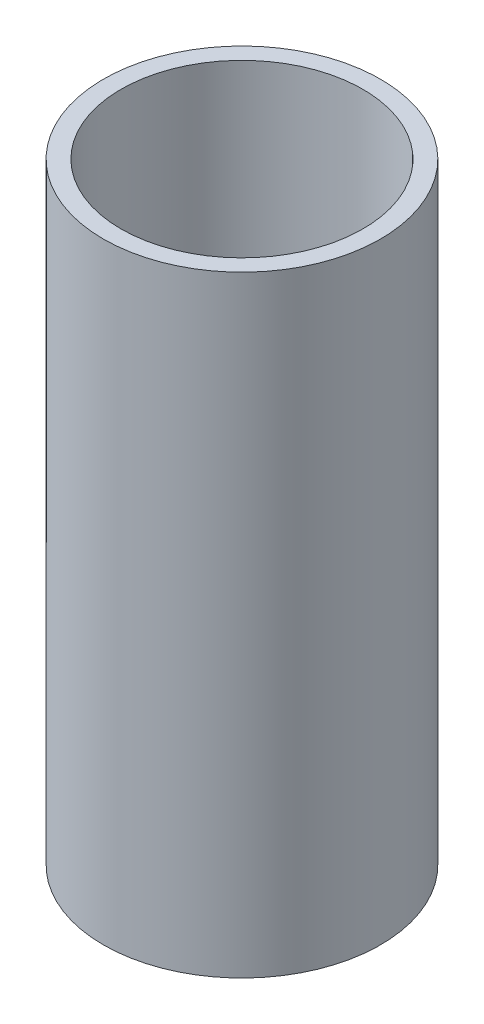
ISO-10303-21;
HEADER;
FILE_DESCRIPTION(('STEP AP214'),'2;1');
FILE_NAME('part.step','',(''),(''),'','','');
FILE_SCHEMA(('AUTOMOTIVE_DESIGN { 1 0 10303 214 1 1 1 1 }'));
ENDSEC;
DATA;
#1=APPLICATION_CONTEXT('core data for automotive mechanical design processes');
#2=APPLICATION_PROTOCOL_DEFINITION('international standard','automotive_design',2000,#1);
#3=PRODUCT_CONTEXT('',#1,'mechanical');
#4=PRODUCT('Part','Part','',(#3));
#5=PRODUCT_RELATED_PRODUCT_CATEGORY('part','',(#4));
#6=PRODUCT_DEFINITION_FORMATION('','',#4);
#7=PRODUCT_DEFINITION_CONTEXT('part definition',#1,'design');
#8=PRODUCT_DEFINITION('design','',#6,#7);
#9=PRODUCT_DEFINITION_SHAPE('','',#8);
#10=(LENGTH_UNIT() NAMED_UNIT(*) SI_UNIT(.MILLI.,.METRE.));
#11=(NAMED_UNIT(*) PLANE_ANGLE_UNIT() SI_UNIT($,.RADIAN.));
#12=(NAMED_UNIT(*) SI_UNIT($,.STERADIAN.) SOLID_ANGLE_UNIT());
#13=UNCERTAINTY_MEASURE_WITH_UNIT(LENGTH_MEASURE(1.E-05),#10,'distance_accuracy_value','');
#14=(GEOMETRIC_REPRESENTATION_CONTEXT(3) GLOBAL_UNCERTAINTY_ASSIGNED_CONTEXT((#13)) GLOBAL_UNIT_ASSIGNED_CONTEXT((#10,
#11,#12)) REPRESENTATION_CONTEXT('',''));
#15=CARTESIAN_POINT('',(0.,0.,0.));
#16=DIRECTION('',(0.,0.,1.));
#17=DIRECTION('',(1.,0.,0.));
#18=AXIS2_PLACEMENT_3D('',#15,#16,#17);
#19=CARTESIAN_POINT('',(0.,31.,0.));
#20=DIRECTION('',(0.,1.,0.));
#21=DIRECTION('',(0.,0.,1.));
#22=AXIS2_PLACEMENT_3D('',#19,#20,#21);
#23=PLANE('',#22);
#24=CARTESIAN_POINT('',(0.,31.,0.));
#25=DIRECTION('',(0.,1.,0.));
#26=DIRECTION('',(0.,0.,1.));
#27=AXIS2_PLACEMENT_3D('',#24,#25,#26);
#28=CIRCLE('',#27,7.025);
#29=CARTESIAN_POINT('',(0.,31.,7.025));
#30=VERTEX_POINT('',#29);
#31=EDGE_CURVE('E10',#30,#30,#28,.T.);
#32=ORIENTED_EDGE('',*,*,#31,.T.);
#33=EDGE_LOOP('',(#32));
#34=FACE_BOUND('',#33,.T.);
#35=CARTESIAN_POINT('',(0.,31.,0.));
#36=DIRECTION('',(0.,1.,0.));
#37=DIRECTION('',(0.,0.,1.));
#38=AXIS2_PLACEMENT_3D('',#35,#36,#37);
#39=CIRCLE('',#38,6.135);
#40=CARTESIAN_POINT('',(0.,31.,6.135));
#41=VERTEX_POINT('',#40);
#42=EDGE_CURVE('E56',#41,#41,#39,.T.);
#43=ORIENTED_EDGE('',*,*,#42,.F.);
#44=EDGE_LOOP('',(#43));
#45=FACE_BOUND('',#44,.T.);
#46=ADVANCED_FACE('F43',(#34,#45),#23,.T.);
#47=CARTESIAN_POINT('',(0.,0.,0.));
#48=DIRECTION('',(0.,1.,0.));
#49=DIRECTION('',(0.,0.,1.));
#50=AXIS2_PLACEMENT_3D('',#47,#48,#49);
#51=PLANE('',#50);
#52=CARTESIAN_POINT('',(0.,0.,0.));
#53=DIRECTION('',(0.,1.,0.));
#54=DIRECTION('',(0.,0.,1.));
#55=AXIS2_PLACEMENT_3D('',#52,#53,#54);
#56=CIRCLE('',#55,7.025);
#57=CARTESIAN_POINT('',(0.,0.,7.025));
#58=VERTEX_POINT('',#57);
#59=EDGE_CURVE('E47',#58,#58,#56,.T.);
#60=ORIENTED_EDGE('',*,*,#59,.F.);
#61=EDGE_LOOP('',(#60));
#62=FACE_BOUND('',#61,.T.);
#63=CARTESIAN_POINT('',(0.,0.,0.));
#64=DIRECTION('',(0.,1.,0.));
#65=DIRECTION('',(0.,0.,1.));
#66=AXIS2_PLACEMENT_3D('',#63,#64,#65);
#67=CIRCLE('',#66,6.135);
#68=CARTESIAN_POINT('',(0.,0.,6.135));
#69=VERTEX_POINT('',#68);
#70=EDGE_CURVE('E58',#69,#69,#67,.T.);
#71=ORIENTED_EDGE('',*,*,#70,.T.);
#72=EDGE_LOOP('',(#71));
#73=FACE_BOUND('',#72,.T.);
#74=ADVANCED_FACE('F70',(#62,#73),#51,.F.);
#75=CARTESIAN_POINT('',(0.,31.,0.));
#76=DIRECTION('',(0.,-1.,0.));
#77=DIRECTION('',(0.,0.,-1.));
#78=AXIS2_PLACEMENT_3D('',#75,#76,#77);
#79=CYLINDRICAL_SURFACE('',#78,7.025);
#80=ORIENTED_EDGE('',*,*,#31,.F.);
#81=EDGE_LOOP('',(#80));
#82=FACE_BOUND('',#81,.T.);
#83=ORIENTED_EDGE('',*,*,#59,.T.);
#84=EDGE_LOOP('',(#83));
#85=FACE_BOUND('',#84,.T.);
#86=ADVANCED_FACE('F45',(#82,#85),#79,.T.);
#87=CARTESIAN_POINT('',(0.,31.,0.));
#88=DIRECTION('',(0.,-1.,0.));
#89=DIRECTION('',(0.,0.,-1.));
#90=AXIS2_PLACEMENT_3D('',#87,#88,#89);
#91=CYLINDRICAL_SURFACE('',#90,6.135);
#92=ORIENTED_EDGE('',*,*,#42,.T.);
#93=EDGE_LOOP('',(#92));
#94=FACE_BOUND('',#93,.T.);
#95=ORIENTED_EDGE('',*,*,#70,.F.);
#96=EDGE_LOOP('',(#95));
#97=FACE_BOUND('',#96,.T.);
#98=ADVANCED_FACE('F66',(#94,#97),#91,.F.);
#99=CLOSED_SHELL('',(#46,#74,#86,#98));
#100=MANIFOLD_SOLID_BREP('B2',#99);
#101=ADVANCED_BREP_SHAPE_REPRESENTATION('',(#18,#100),#14);
#102=SHAPE_DEFINITION_REPRESENTATION(#9,#101);
ENDSEC;
END-ISO-10303-21;
